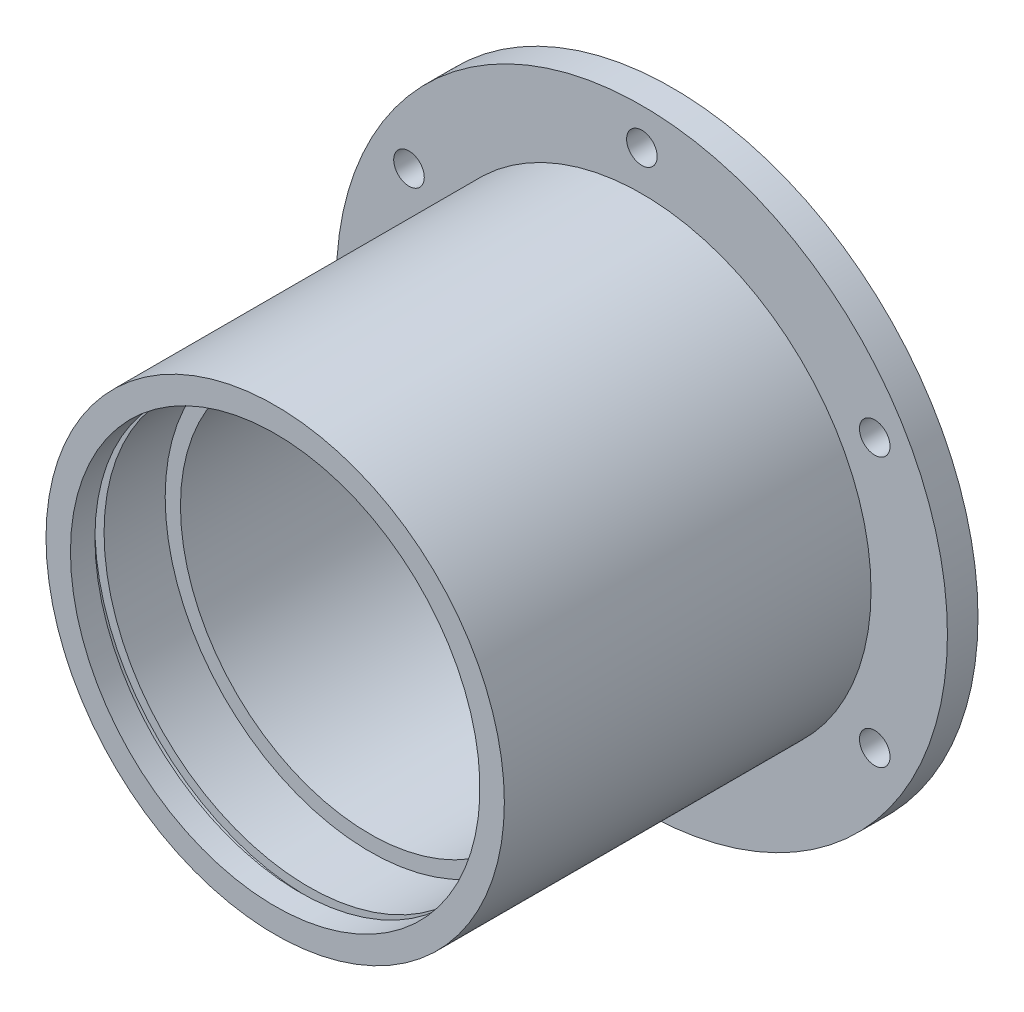
ISO-10303-21;
HEADER;
FILE_DESCRIPTION(('STEP AP214'),'2;1');
FILE_NAME('part.step','',(''),(''),'','','');
FILE_SCHEMA(('AUTOMOTIVE_DESIGN { 1 0 10303 214 1 1 1 1 }'));
ENDSEC;
DATA;
#1=APPLICATION_CONTEXT('core data for automotive mechanical design processes');
#2=APPLICATION_PROTOCOL_DEFINITION('international standard','automotive_design',2000,#1);
#3=PRODUCT_CONTEXT('',#1,'mechanical');
#4=PRODUCT('Part','Part','',(#3));
#5=PRODUCT_RELATED_PRODUCT_CATEGORY('part','',(#4));
#6=PRODUCT_DEFINITION_FORMATION('','',#4);
#7=PRODUCT_DEFINITION_CONTEXT('part definition',#1,'design');
#8=PRODUCT_DEFINITION('design','',#6,#7);
#9=PRODUCT_DEFINITION_SHAPE('','',#8);
#10=(LENGTH_UNIT() NAMED_UNIT(*) SI_UNIT(.MILLI.,.METRE.));
#11=(NAMED_UNIT(*) PLANE_ANGLE_UNIT() SI_UNIT($,.RADIAN.));
#12=(NAMED_UNIT(*) SI_UNIT($,.STERADIAN.) SOLID_ANGLE_UNIT());
#13=UNCERTAINTY_MEASURE_WITH_UNIT(LENGTH_MEASURE(1.E-05),#10,'distance_accuracy_value','');
#14=(GEOMETRIC_REPRESENTATION_CONTEXT(3) GLOBAL_UNCERTAINTY_ASSIGNED_CONTEXT((#13)) GLOBAL_UNIT_ASSIGNED_CONTEXT((#10,
#11,#12)) REPRESENTATION_CONTEXT('',''));
#15=CARTESIAN_POINT('',(0.,0.,0.));
#16=DIRECTION('',(0.,0.,1.));
#17=DIRECTION('',(1.,0.,0.));
#18=AXIS2_PLACEMENT_3D('',#15,#16,#17);
#19=CARTESIAN_POINT('',(0.,0.,65.));
#20=DIRECTION('',(0.,0.,-1.));
#21=DIRECTION('',(-1.,0.,0.));
#22=AXIS2_PLACEMENT_3D('',#19,#20,#21);
#23=CYLINDRICAL_SURFACE('',#22,33.5);
#24=CARTESIAN_POINT('',(0.,0.,49.5));
#25=DIRECTION('',(0.,0.,-1.));
#26=DIRECTION('',(-1.,0.,0.));
#27=AXIS2_PLACEMENT_3D('',#24,#25,#26);
#28=CIRCLE('',#27,33.5);
#29=CARTESIAN_POINT('',(-33.5,0.,49.5));
#30=VERTEX_POINT('',#29);
#31=EDGE_CURVE('E50',#30,#30,#28,.T.);
#32=CARTESIAN_POINT('',(0.,0.,59.5));
#33=DIRECTION('',(0.,0.,1.));
#34=DIRECTION('',(1.,0.,0.));
#35=AXIS2_PLACEMENT_3D('',#32,#33,#34);
#36=CIRCLE('',#35,33.5);
#37=CARTESIAN_POINT('',(-33.5,0.,59.5));
#38=VERTEX_POINT('',#37);
#39=EDGE_CURVE('E37',#38,#38,#36,.T.);
#40=CARTESIAN_POINT('',(-33.5,0.,49.5));
#41=CARTESIAN_POINT('',(-33.5,0.,49.6041666666667));
#42=CARTESIAN_POINT('',(-33.5,0.,49.7083333333333));
#43=CARTESIAN_POINT('',(-33.5,0.,49.9166666666667));
#44=CARTESIAN_POINT('',(-33.5,0.,50.0208333333333));
#45=CARTESIAN_POINT('',(-33.5,0.,50.2291666666667));
#46=CARTESIAN_POINT('',(-33.5,0.,50.3333333333333));
#47=CARTESIAN_POINT('',(-33.5,0.,50.5416666666667));
#48=CARTESIAN_POINT('',(-33.5,0.,50.6458333333333));
#49=CARTESIAN_POINT('',(-33.5,0.,50.8541666666667));
#50=CARTESIAN_POINT('',(-33.5,0.,50.9583333333333));
#51=CARTESIAN_POINT('',(-33.5,0.,51.1666666666667));
#52=CARTESIAN_POINT('',(-33.5,0.,51.2708333333333));
#53=CARTESIAN_POINT('',(-33.5,0.,51.4791666666667));
#54=CARTESIAN_POINT('',(-33.5,0.,51.5833333333333));
#55=CARTESIAN_POINT('',(-33.5,0.,51.7916666666667));
#56=CARTESIAN_POINT('',(-33.5,0.,51.8958333333333));
#57=CARTESIAN_POINT('',(-33.5,0.,52.1041666666667));
#58=CARTESIAN_POINT('',(-33.5,0.,52.2083333333333));
#59=CARTESIAN_POINT('',(-33.5,0.,52.4166666666667));
#60=CARTESIAN_POINT('',(-33.5,0.,52.5208333333333));
#61=CARTESIAN_POINT('',(-33.5,0.,52.7291666666667));
#62=CARTESIAN_POINT('',(-33.5,0.,52.8333333333333));
#63=CARTESIAN_POINT('',(-33.5,0.,53.0416666666667));
#64=CARTESIAN_POINT('',(-33.5,0.,53.1458333333333));
#65=CARTESIAN_POINT('',(-33.5,0.,53.3541666666667));
#66=CARTESIAN_POINT('',(-33.5,0.,53.4583333333333));
#67=CARTESIAN_POINT('',(-33.5,0.,53.6666666666667));
#68=CARTESIAN_POINT('',(-33.5,0.,53.7708333333333));
#69=CARTESIAN_POINT('',(-33.5,0.,53.9791666666667));
#70=CARTESIAN_POINT('',(-33.5,0.,54.0833333333333));
#71=CARTESIAN_POINT('',(-33.5,0.,54.2916666666667));
#72=CARTESIAN_POINT('',(-33.5,0.,54.3958333333333));
#73=CARTESIAN_POINT('',(-33.5,0.,54.6041666666667));
#74=CARTESIAN_POINT('',(-33.5,0.,54.7083333333333));
#75=CARTESIAN_POINT('',(-33.5,0.,54.9166666666667));
#76=CARTESIAN_POINT('',(-33.5,0.,55.0208333333333));
#77=CARTESIAN_POINT('',(-33.5,0.,55.2291666666667));
#78=CARTESIAN_POINT('',(-33.5,0.,55.3333333333333));
#79=CARTESIAN_POINT('',(-33.5,0.,55.5416666666667));
#80=CARTESIAN_POINT('',(-33.5,0.,55.6458333333333));
#81=CARTESIAN_POINT('',(-33.5,0.,55.8541666666667));
#82=CARTESIAN_POINT('',(-33.5,0.,55.9583333333333));
#83=CARTESIAN_POINT('',(-33.5,0.,56.1666666666667));
#84=CARTESIAN_POINT('',(-33.5,0.,56.2708333333333));
#85=CARTESIAN_POINT('',(-33.5,0.,56.4791666666667));
#86=CARTESIAN_POINT('',(-33.5,0.,56.5833333333333));
#87=CARTESIAN_POINT('',(-33.5,0.,56.7916666666667));
#88=CARTESIAN_POINT('',(-33.5,0.,56.8958333333333));
#89=CARTESIAN_POINT('',(-33.5,0.,57.1041666666667));
#90=CARTESIAN_POINT('',(-33.5,0.,57.2083333333333));
#91=CARTESIAN_POINT('',(-33.5,0.,57.4166666666667));
#92=CARTESIAN_POINT('',(-33.5,0.,57.5208333333333));
#93=CARTESIAN_POINT('',(-33.5,0.,57.7291666666667));
#94=CARTESIAN_POINT('',(-33.5,0.,57.8333333333333));
#95=CARTESIAN_POINT('',(-33.5,0.,58.0416666666667));
#96=CARTESIAN_POINT('',(-33.5,0.,58.1458333333333));
#97=CARTESIAN_POINT('',(-33.5,0.,58.3541666666667));
#98=CARTESIAN_POINT('',(-33.5,0.,58.4583333333333));
#99=CARTESIAN_POINT('',(-33.5,0.,58.6666666666667));
#100=CARTESIAN_POINT('',(-33.5,0.,58.7708333333333));
#101=CARTESIAN_POINT('',(-33.5,0.,58.9791666666667));
#102=CARTESIAN_POINT('',(-33.5,0.,59.0833333333333));
#103=CARTESIAN_POINT('',(-33.5,0.,59.2916666666667));
#104=CARTESIAN_POINT('',(-33.5,0.,59.3958333333333));
#105=CARTESIAN_POINT('',(-33.5,0.,59.5));
#106=B_SPLINE_CURVE_WITH_KNOTS('',3,(#40,#41,#42,#43,#44,#45,#46,#47,#48,#49,#50,#51,#52,#53,
#54,#55,#56,#57,#58,#59,#60,#61,#62,#63,#64,#65,#66,#67,#68,#69,#70,#71,#72,#73,#74,#75,#76,#77,
#78,#79,#80,#81,#82,#83,#84,#85,#86,#87,#88,#89,#90,#91,#92,#93,#94,#95,#96,#97,#98,#99,#100,
#101,#102,#103,#104,#105),.UNSPECIFIED.,.F.,.F.,(4,2,2,2,2,2,2,2,2,2,2,2,2,2,2,2,2,2,2,2,2,2,2,
2,2,2,2,2,2,2,2,2,4),(0.,0.3125,0.625000000000001,0.937500000000001,1.24999999999999,1.5625,
1.87499999999999,2.1875,2.5,2.8125,3.125,3.4375,3.75,4.0625,4.375,4.6875,5.,5.3125,5.625,
5.93749999999999,6.25,6.56249999999999,6.87499999999999,7.18749999999999,7.49999999999999,
7.81249999999999,8.12499999999999,8.43749999999999,8.74999999999999,9.06249999999999,
9.37499999999999,9.68749999999999,9.99999999999999),.UNSPECIFIED.);
#107=EDGE_CURVE('BSEAM33',#30,#38,#106,.T.);
#108=ORIENTED_EDGE('',*,*,#31,.T.);
#109=ORIENTED_EDGE('',*,*,#39,.T.);
#110=ORIENTED_EDGE('',*,*,#107,.T.);
#111=ORIENTED_EDGE('',*,*,#107,.F.);
#112=EDGE_LOOP('',(#108,#110,#109,#111));
#113=FACE_BOUND('',#112,.T.);
#114=ADVANCED_FACE('F33',(#113),#23,.F.);
#115=CARTESIAN_POINT('',(0.,0.,15.5));
#116=DIRECTION('',(0.,0.,-1.));
#117=DIRECTION('',(-1.,0.,0.));
#118=AXIS2_PLACEMENT_3D('',#115,#116,#117);
#119=CIRCLE('',#118,33.5);
#120=CARTESIAN_POINT('',(-33.5,0.,15.5));
#121=VERTEX_POINT('',#120);
#122=EDGE_CURVE('E11',#121,#121,#119,.T.);
#123=CARTESIAN_POINT('',(0.,0.,5.5));
#124=DIRECTION('',(0.,0.,-1.));
#125=DIRECTION('',(-1.,0.,0.));
#126=AXIS2_PLACEMENT_3D('',#123,#124,#125);
#127=CIRCLE('',#126,33.5);
#128=CARTESIAN_POINT('',(-33.5,0.,5.5));
#129=VERTEX_POINT('',#128);
#130=EDGE_CURVE('E58',#129,#129,#127,.T.);
#131=CARTESIAN_POINT('',(-33.5,0.,15.5));
#132=CARTESIAN_POINT('',(-33.5,0.,15.3958333333333));
#133=CARTESIAN_POINT('',(-33.5,0.,15.2916666666667));
#134=CARTESIAN_POINT('',(-33.5,0.,15.0833333333333));
#135=CARTESIAN_POINT('',(-33.5,0.,14.9791666666667));
#136=CARTESIAN_POINT('',(-33.5,0.,14.7708333333333));
#137=CARTESIAN_POINT('',(-33.5,0.,14.6666666666667));
#138=CARTESIAN_POINT('',(-33.5,0.,14.4583333333333));
#139=CARTESIAN_POINT('',(-33.5,0.,14.3541666666667));
#140=CARTESIAN_POINT('',(-33.5,0.,14.1458333333333));
#141=CARTESIAN_POINT('',(-33.5,0.,14.0416666666667));
#142=CARTESIAN_POINT('',(-33.5,0.,13.8333333333333));
#143=CARTESIAN_POINT('',(-33.5,0.,13.7291666666667));
#144=CARTESIAN_POINT('',(-33.5,0.,13.5208333333333));
#145=CARTESIAN_POINT('',(-33.5,0.,13.4166666666667));
#146=CARTESIAN_POINT('',(-33.5,0.,13.2083333333333));
#147=CARTESIAN_POINT('',(-33.5,0.,13.1041666666667));
#148=CARTESIAN_POINT('',(-33.5,0.,12.8958333333333));
#149=CARTESIAN_POINT('',(-33.5,0.,12.7916666666667));
#150=CARTESIAN_POINT('',(-33.5,0.,12.5833333333333));
#151=CARTESIAN_POINT('',(-33.5,0.,12.4791666666667));
#152=CARTESIAN_POINT('',(-33.5,0.,12.2708333333333));
#153=CARTESIAN_POINT('',(-33.5,0.,12.1666666666667));
#154=CARTESIAN_POINT('',(-33.5,0.,11.9583333333333));
#155=CARTESIAN_POINT('',(-33.5,0.,11.8541666666667));
#156=CARTESIAN_POINT('',(-33.5,0.,11.6458333333333));
#157=CARTESIAN_POINT('',(-33.5,0.,11.5416666666667));
#158=CARTESIAN_POINT('',(-33.5,0.,11.3333333333333));
#159=CARTESIAN_POINT('',(-33.5,0.,11.2291666666667));
#160=CARTESIAN_POINT('',(-33.5,0.,11.0208333333333));
#161=CARTESIAN_POINT('',(-33.5,0.,10.9166666666667));
#162=CARTESIAN_POINT('',(-33.5,0.,10.7083333333333));
#163=CARTESIAN_POINT('',(-33.5,0.,10.6041666666667));
#164=CARTESIAN_POINT('',(-33.5,0.,10.3958333333333));
#165=CARTESIAN_POINT('',(-33.5,0.,10.2916666666667));
#166=CARTESIAN_POINT('',(-33.5,0.,10.0833333333333));
#167=CARTESIAN_POINT('',(-33.5,0.,9.97916666666667));
#168=CARTESIAN_POINT('',(-33.5,0.,9.77083333333333));
#169=CARTESIAN_POINT('',(-33.5,0.,9.66666666666667));
#170=CARTESIAN_POINT('',(-33.5,0.,9.45833333333333));
#171=CARTESIAN_POINT('',(-33.5,0.,9.35416666666667));
#172=CARTESIAN_POINT('',(-33.5,0.,9.14583333333333));
#173=CARTESIAN_POINT('',(-33.5,0.,9.04166666666667));
#174=CARTESIAN_POINT('',(-33.5,0.,8.83333333333333));
#175=CARTESIAN_POINT('',(-33.5,0.,8.72916666666667));
#176=CARTESIAN_POINT('',(-33.5,0.,8.52083333333333));
#177=CARTESIAN_POINT('',(-33.5,0.,8.41666666666667));
#178=CARTESIAN_POINT('',(-33.5,0.,8.20833333333333));
#179=CARTESIAN_POINT('',(-33.5,0.,8.10416666666667));
#180=CARTESIAN_POINT('',(-33.5,0.,7.89583333333333));
#181=CARTESIAN_POINT('',(-33.5,0.,7.79166666666667));
#182=CARTESIAN_POINT('',(-33.5,0.,7.58333333333333));
#183=CARTESIAN_POINT('',(-33.5,0.,7.47916666666667));
#184=CARTESIAN_POINT('',(-33.5,0.,7.27083333333333));
#185=CARTESIAN_POINT('',(-33.5,0.,7.16666666666667));
#186=CARTESIAN_POINT('',(-33.5,0.,6.95833333333333));
#187=CARTESIAN_POINT('',(-33.5,0.,6.85416666666667));
#188=CARTESIAN_POINT('',(-33.5,0.,6.64583333333333));
#189=CARTESIAN_POINT('',(-33.5,0.,6.54166666666667));
#190=CARTESIAN_POINT('',(-33.5,0.,6.33333333333333));
#191=CARTESIAN_POINT('',(-33.5,0.,6.22916666666667));
#192=CARTESIAN_POINT('',(-33.5,0.,6.02083333333333));
#193=CARTESIAN_POINT('',(-33.5,0.,5.91666666666666));
#194=CARTESIAN_POINT('',(-33.5,0.,5.70833333333333));
#195=CARTESIAN_POINT('',(-33.5,0.,5.60416666666666));
#196=CARTESIAN_POINT('',(-33.5,0.,5.5));
#197=B_SPLINE_CURVE_WITH_KNOTS('',3,(#131,#132,#133,#134,#135,#136,#137,#138,#139,#140,#141,
#142,#143,#144,#145,#146,#147,#148,#149,#150,#151,#152,#153,#154,#155,#156,#157,#158,#159,#160,
#161,#162,#163,#164,#165,#166,#167,#168,#169,#170,#171,#172,#173,#174,#175,#176,#177,#178,#179,
#180,#181,#182,#183,#184,#185,#186,#187,#188,#189,#190,#191,#192,#193,#194,#195,#196),
.UNSPECIFIED.,.F.,.F.,(4,2,2,2,2,2,2,2,2,2,2,2,2,2,2,2,2,2,2,2,2,2,2,2,2,2,2,2,2,2,2,2,4),(0.,
0.3125,0.625000000000001,0.937500000000001,1.25,1.5625,1.875,2.1875,2.5,2.8125,3.125,3.4375,
3.75,4.0625,4.375,4.6875,5.,5.3125,5.62500000000001,5.93750000000001,6.25000000000001,
6.56250000000001,6.87500000000001,7.18750000000001,7.50000000000001,7.81250000000001,
8.12500000000001,8.43750000000001,8.75000000000001,9.06250000000001,9.37500000000001,
9.68750000000001,10.),.UNSPECIFIED.);
#198=EDGE_CURVE('BSEAM151',#121,#129,#197,.T.);
#199=ORIENTED_EDGE('',*,*,#122,.F.);
#200=ORIENTED_EDGE('',*,*,#130,.T.);
#201=ORIENTED_EDGE('',*,*,#198,.T.);
#202=ORIENTED_EDGE('',*,*,#198,.F.);
#203=EDGE_LOOP('',(#199,#201,#200,#202));
#204=FACE_BOUND('',#203,.T.);
#205=ADVANCED_FACE('F151',(#204),#23,.F.);
#206=CARTESIAN_POINT('',(0.,0.,0.));
#207=DIRECTION('',(0.,0.,-1.));
#208=DIRECTION('',(-1.,0.,0.));
#209=AXIS2_PLACEMENT_3D('',#206,#207,#208);
#210=CIRCLE('',#209,33.5);
#211=CARTESIAN_POINT('',(-33.5,0.,0.));
#212=VERTEX_POINT('',#211);
#213=EDGE_CURVE('E53',#212,#212,#210,.T.);
#214=CARTESIAN_POINT('',(0.,0.,4.));
#215=DIRECTION('',(0.,0.,1.));
#216=DIRECTION('',(1.,0.,0.));
#217=AXIS2_PLACEMENT_3D('',#214,#215,#216);
#218=CIRCLE('',#217,33.5);
#219=CARTESIAN_POINT('',(-33.5,0.,4.));
#220=VERTEX_POINT('',#219);
#221=EDGE_CURVE('E55',#220,#220,#218,.T.);
#222=CARTESIAN_POINT('',(-33.5,0.,0.));
#223=CARTESIAN_POINT('',(-33.5,0.,0.0416666666666805));
#224=CARTESIAN_POINT('',(-33.5,0.,0.0833333333333473));
#225=CARTESIAN_POINT('',(-33.5,0.,0.166666666666681));
#226=CARTESIAN_POINT('',(-33.5,0.,0.208333333333347));
#227=CARTESIAN_POINT('',(-33.5,0.,0.291666666666681));
#228=CARTESIAN_POINT('',(-33.5,0.,0.333333333333347));
#229=CARTESIAN_POINT('',(-33.5,0.,0.416666666666681));
#230=CARTESIAN_POINT('',(-33.5,0.,0.458333333333348));
#231=CARTESIAN_POINT('',(-33.5,0.,0.541666666666681));
#232=CARTESIAN_POINT('',(-33.5,0.,0.583333333333348));
#233=CARTESIAN_POINT('',(-33.5,0.,0.666666666666681));
#234=CARTESIAN_POINT('',(-33.5,0.,0.708333333333348));
#235=CARTESIAN_POINT('',(-33.5,0.,0.791666666666681));
#236=CARTESIAN_POINT('',(-33.5,0.,0.833333333333348));
#237=CARTESIAN_POINT('',(-33.5,0.,0.916666666666681));
#238=CARTESIAN_POINT('',(-33.5,0.,0.958333333333348));
#239=CARTESIAN_POINT('',(-33.5,0.,1.04166666666668));
#240=CARTESIAN_POINT('',(-33.5,0.,1.08333333333335));
#241=CARTESIAN_POINT('',(-33.5,0.,1.16666666666668));
#242=CARTESIAN_POINT('',(-33.5,0.,1.20833333333335));
#243=CARTESIAN_POINT('',(-33.5,0.,1.29166666666668));
#244=CARTESIAN_POINT('',(-33.5,0.,1.33333333333335));
#245=CARTESIAN_POINT('',(-33.5,0.,1.41666666666668));
#246=CARTESIAN_POINT('',(-33.5,0.,1.45833333333335));
#247=CARTESIAN_POINT('',(-33.5,0.,1.54166666666668));
#248=CARTESIAN_POINT('',(-33.5,0.,1.58333333333335));
#249=CARTESIAN_POINT('',(-33.5,0.,1.66666666666668));
#250=CARTESIAN_POINT('',(-33.5,0.,1.70833333333335));
#251=CARTESIAN_POINT('',(-33.5,0.,1.79166666666668));
#252=CARTESIAN_POINT('',(-33.5,0.,1.83333333333335));
#253=CARTESIAN_POINT('',(-33.5,0.,1.91666666666668));
#254=CARTESIAN_POINT('',(-33.5,0.,1.95833333333335));
#255=CARTESIAN_POINT('',(-33.5,0.,2.04166666666668));
#256=CARTESIAN_POINT('',(-33.5,0.,2.08333333333334));
#257=CARTESIAN_POINT('',(-33.5,0.,2.16666666666667));
#258=CARTESIAN_POINT('',(-33.5,0.,2.20833333333334));
#259=CARTESIAN_POINT('',(-33.5,0.,2.29166666666667));
#260=CARTESIAN_POINT('',(-33.5,0.,2.33333333333334));
#261=CARTESIAN_POINT('',(-33.5,0.,2.41666666666667));
#262=CARTESIAN_POINT('',(-33.5,0.,2.45833333333334));
#263=CARTESIAN_POINT('',(-33.5,0.,2.54166666666667));
#264=CARTESIAN_POINT('',(-33.5,0.,2.58333333333334));
#265=CARTESIAN_POINT('',(-33.5,0.,2.66666666666667));
#266=CARTESIAN_POINT('',(-33.5,0.,2.70833333333334));
#267=CARTESIAN_POINT('',(-33.5,0.,2.79166666666667));
#268=CARTESIAN_POINT('',(-33.5,0.,2.83333333333334));
#269=CARTESIAN_POINT('',(-33.5,0.,2.91666666666667));
#270=CARTESIAN_POINT('',(-33.5,0.,2.95833333333333));
#271=CARTESIAN_POINT('',(-33.5,0.,3.04166666666666));
#272=CARTESIAN_POINT('',(-33.5,0.,3.08333333333333));
#273=CARTESIAN_POINT('',(-33.5,0.,3.16666666666666));
#274=CARTESIAN_POINT('',(-33.5,0.,3.20833333333333));
#275=CARTESIAN_POINT('',(-33.5,0.,3.29166666666666));
#276=CARTESIAN_POINT('',(-33.5,0.,3.33333333333333));
#277=CARTESIAN_POINT('',(-33.5,0.,3.41666666666666));
#278=CARTESIAN_POINT('',(-33.5,0.,3.45833333333333));
#279=CARTESIAN_POINT('',(-33.5,0.,3.54166666666666));
#280=CARTESIAN_POINT('',(-33.5,0.,3.58333333333333));
#281=CARTESIAN_POINT('',(-33.5,0.,3.66666666666666));
#282=CARTESIAN_POINT('',(-33.5,0.,3.70833333333333));
#283=CARTESIAN_POINT('',(-33.5,0.,3.79166666666666));
#284=CARTESIAN_POINT('',(-33.5,0.,3.83333333333333));
#285=CARTESIAN_POINT('',(-33.5,0.,3.91666666666666));
#286=CARTESIAN_POINT('',(-33.5,0.,3.95833333333333));
#287=CARTESIAN_POINT('',(-33.5,0.,4.));
#288=B_SPLINE_CURVE_WITH_KNOTS('',3,(#222,#223,#224,#225,#226,#227,#228,#229,#230,#231,#232,
#233,#234,#235,#236,#237,#238,#239,#240,#241,#242,#243,#244,#245,#246,#247,#248,#249,#250,#251,
#252,#253,#254,#255,#256,#257,#258,#259,#260,#261,#262,#263,#264,#265,#266,#267,#268,#269,#270,
#271,#272,#273,#274,#275,#276,#277,#278,#279,#280,#281,#282,#283,#284,#285,#286,#287),
.UNSPECIFIED.,.F.,.F.,(4,2,2,2,2,2,2,2,2,2,2,2,2,2,2,2,2,2,2,2,2,2,2,2,2,2,2,2,2,2,2,2,4),(0.,
0.125,0.25,0.375,0.5,0.625000000000001,0.750000000000001,0.875000000000001,1.,1.125,1.25,1.375,
1.5,1.625,1.75,1.875,2.,2.12499999999999,2.24999999999999,2.37499999999999,2.49999999999999,
2.62499999999999,2.74999999999999,2.87499999999999,2.99999999999998,3.12499999999998,
3.24999999999998,3.37499999999998,3.49999999999998,3.62499999999998,3.74999999999998,
3.87499999999998,3.99999999999998),.UNSPECIFIED.);
#289=EDGE_CURVE('BSEAM154',#212,#220,#288,.T.);
#290=ORIENTED_EDGE('',*,*,#213,.T.);
#291=ORIENTED_EDGE('',*,*,#221,.T.);
#292=ORIENTED_EDGE('',*,*,#289,.T.);
#293=ORIENTED_EDGE('',*,*,#289,.F.);
#294=EDGE_LOOP('',(#290,#292,#291,#293));
#295=FACE_BOUND('',#294,.T.);
#296=ADVANCED_FACE('F154',(#295),#23,.F.);
#297=CARTESIAN_POINT('',(0.,0.,61.));
#298=DIRECTION('',(0.,0.,1.));
#299=DIRECTION('',(1.,0.,0.));
#300=AXIS2_PLACEMENT_3D('',#297,#298,#299);
#301=CIRCLE('',#300,33.5);
#302=CARTESIAN_POINT('',(-33.5,0.,61.));
#303=VERTEX_POINT('',#302);
#304=EDGE_CURVE('E62',#303,#303,#301,.T.);
#305=CARTESIAN_POINT('',(0.,0.,65.));
#306=DIRECTION('',(0.,0.,1.));
#307=DIRECTION('',(1.,0.,0.));
#308=AXIS2_PLACEMENT_3D('',#305,#306,#307);
#309=CIRCLE('',#308,33.5);
#310=CARTESIAN_POINT('',(-33.5,0.,65.));
#311=VERTEX_POINT('',#310);
#312=EDGE_CURVE('E87',#311,#311,#309,.T.);
#313=CARTESIAN_POINT('',(-33.5,0.,61.));
#314=CARTESIAN_POINT('',(-33.5,0.,61.0416666666667));
#315=CARTESIAN_POINT('',(-33.5,0.,61.0833333333333));
#316=CARTESIAN_POINT('',(-33.5,0.,61.1666666666667));
#317=CARTESIAN_POINT('',(-33.5,0.,61.2083333333333));
#318=CARTESIAN_POINT('',(-33.5,0.,61.2916666666667));
#319=CARTESIAN_POINT('',(-33.5,0.,61.3333333333333));
#320=CARTESIAN_POINT('',(-33.5,0.,61.4166666666667));
#321=CARTESIAN_POINT('',(-33.5,0.,61.4583333333333));
#322=CARTESIAN_POINT('',(-33.5,0.,61.5416666666667));
#323=CARTESIAN_POINT('',(-33.5,0.,61.5833333333333));
#324=CARTESIAN_POINT('',(-33.5,0.,61.6666666666667));
#325=CARTESIAN_POINT('',(-33.5,0.,61.7083333333333));
#326=CARTESIAN_POINT('',(-33.5,0.,61.7916666666667));
#327=CARTESIAN_POINT('',(-33.5,0.,61.8333333333333));
#328=CARTESIAN_POINT('',(-33.5,0.,61.9166666666667));
#329=CARTESIAN_POINT('',(-33.5,0.,61.9583333333333));
#330=CARTESIAN_POINT('',(-33.5,0.,62.0416666666667));
#331=CARTESIAN_POINT('',(-33.5,0.,62.0833333333333));
#332=CARTESIAN_POINT('',(-33.5,0.,62.1666666666667));
#333=CARTESIAN_POINT('',(-33.5,0.,62.2083333333333));
#334=CARTESIAN_POINT('',(-33.5,0.,62.2916666666667));
#335=CARTESIAN_POINT('',(-33.5,0.,62.3333333333333));
#336=CARTESIAN_POINT('',(-33.5,0.,62.4166666666667));
#337=CARTESIAN_POINT('',(-33.5,0.,62.4583333333333));
#338=CARTESIAN_POINT('',(-33.5,0.,62.5416666666667));
#339=CARTESIAN_POINT('',(-33.5,0.,62.5833333333333));
#340=CARTESIAN_POINT('',(-33.5,0.,62.6666666666667));
#341=CARTESIAN_POINT('',(-33.5,0.,62.7083333333333));
#342=CARTESIAN_POINT('',(-33.5,0.,62.7916666666667));
#343=CARTESIAN_POINT('',(-33.5,0.,62.8333333333333));
#344=CARTESIAN_POINT('',(-33.5,0.,62.9166666666667));
#345=CARTESIAN_POINT('',(-33.5,0.,62.9583333333333));
#346=CARTESIAN_POINT('',(-33.5,0.,63.0416666666667));
#347=CARTESIAN_POINT('',(-33.5,0.,63.0833333333333));
#348=CARTESIAN_POINT('',(-33.5,0.,63.1666666666667));
#349=CARTESIAN_POINT('',(-33.5,0.,63.2083333333333));
#350=CARTESIAN_POINT('',(-33.5,0.,63.2916666666667));
#351=CARTESIAN_POINT('',(-33.5,0.,63.3333333333333));
#352=CARTESIAN_POINT('',(-33.5,0.,63.4166666666667));
#353=CARTESIAN_POINT('',(-33.5,0.,63.4583333333333));
#354=CARTESIAN_POINT('',(-33.5,0.,63.5416666666667));
#355=CARTESIAN_POINT('',(-33.5,0.,63.5833333333333));
#356=CARTESIAN_POINT('',(-33.5,0.,63.6666666666667));
#357=CARTESIAN_POINT('',(-33.5,0.,63.7083333333333));
#358=CARTESIAN_POINT('',(-33.5,0.,63.7916666666667));
#359=CARTESIAN_POINT('',(-33.5,0.,63.8333333333333));
#360=CARTESIAN_POINT('',(-33.5,0.,63.9166666666667));
#361=CARTESIAN_POINT('',(-33.5,0.,63.9583333333333));
#362=CARTESIAN_POINT('',(-33.5,0.,64.0416666666667));
#363=CARTESIAN_POINT('',(-33.5,0.,64.0833333333333));
#364=CARTESIAN_POINT('',(-33.5,0.,64.1666666666667));
#365=CARTESIAN_POINT('',(-33.5,0.,64.2083333333333));
#366=CARTESIAN_POINT('',(-33.5,0.,64.2916666666667));
#367=CARTESIAN_POINT('',(-33.5,0.,64.3333333333333));
#368=CARTESIAN_POINT('',(-33.5,0.,64.4166666666667));
#369=CARTESIAN_POINT('',(-33.5,0.,64.4583333333333));
#370=CARTESIAN_POINT('',(-33.5,0.,64.5416666666667));
#371=CARTESIAN_POINT('',(-33.5,0.,64.5833333333333));
#372=CARTESIAN_POINT('',(-33.5,0.,64.6666666666667));
#373=CARTESIAN_POINT('',(-33.5,0.,64.7083333333333));
#374=CARTESIAN_POINT('',(-33.5,0.,64.7916666666667));
#375=CARTESIAN_POINT('',(-33.5,0.,64.8333333333333));
#376=CARTESIAN_POINT('',(-33.5,0.,64.9166666666667));
#377=CARTESIAN_POINT('',(-33.5,0.,64.9583333333333));
#378=CARTESIAN_POINT('',(-33.5,0.,65.));
#379=B_SPLINE_CURVE_WITH_KNOTS('',3,(#313,#314,#315,#316,#317,#318,#319,#320,#321,#322,#323,
#324,#325,#326,#327,#328,#329,#330,#331,#332,#333,#334,#335,#336,#337,#338,#339,#340,#341,#342,
#343,#344,#345,#346,#347,#348,#349,#350,#351,#352,#353,#354,#355,#356,#357,#358,#359,#360,#361,
#362,#363,#364,#365,#366,#367,#368,#369,#370,#371,#372,#373,#374,#375,#376,#377,#378),
.UNSPECIFIED.,.F.,.F.,(4,2,2,2,2,2,2,2,2,2,2,2,2,2,2,2,2,2,2,2,2,2,2,2,2,2,2,2,2,2,2,2,4),(0.,
0.125,0.25,0.375,0.5,0.625000000000001,0.750000000000001,0.875000000000001,1.,1.125,1.25,1.375,
1.5,1.62500000000001,1.75000000000001,1.87500000000001,2.00000000000001,2.12500000000001,
2.25000000000001,2.37500000000001,2.50000000000001,2.62500000000001,2.75000000000001,
2.87500000000001,3.00000000000001,3.12500000000001,3.25000000000001,3.37500000000001,
3.50000000000001,3.62500000000001,3.75000000000001,3.87500000000001,4.00000000000001),.UNSPECIFIED.);
#380=EDGE_CURVE('BSEAM159',#303,#311,#379,.T.);
#381=ORIENTED_EDGE('',*,*,#304,.F.);
#382=ORIENTED_EDGE('',*,*,#312,.T.);
#383=ORIENTED_EDGE('',*,*,#380,.T.);
#384=ORIENTED_EDGE('',*,*,#380,.F.);
#385=EDGE_LOOP('',(#381,#383,#382,#384));
#386=FACE_BOUND('',#385,.T.);
#387=ADVANCED_FACE('F159',(#386),#23,.F.);
#388=CARTESIAN_POINT('',(0.,0.,5.));
#389=DIRECTION('',(0.,0.,1.));
#390=DIRECTION('',(1.,0.,0.));
#391=AXIS2_PLACEMENT_3D('',#388,#389,#390);
#392=PLANE('',#391);
#393=CARTESIAN_POINT('',(0.,0.,5.));
#394=DIRECTION('',(0.,0.,1.));
#395=DIRECTION('',(1.,0.,0.));
#396=AXIS2_PLACEMENT_3D('',#393,#394,#395);
#397=CIRCLE('',#396,37.5);
#398=CARTESIAN_POINT('',(-37.5,0.,5.));
#399=VERTEX_POINT('',#398);
#400=EDGE_CURVE('E90',#399,#399,#397,.T.);
#401=ORIENTED_EDGE('',*,*,#400,.F.);
#402=EDGE_LOOP('',(#401));
#403=FACE_BOUND('',#402,.T.);
#404=CARTESIAN_POINT('',(-38.1051177665146,-22.0000000000004,5.));
#405=DIRECTION('',(0.,0.,1.));
#406=DIRECTION('',(1.,0.,0.));
#407=AXIS2_PLACEMENT_3D('',#404,#405,#406);
#408=CIRCLE('',#407,2.50000000000115);
#409=CARTESIAN_POINT('',(-35.6051177665134,-22.0000000000004,5.));
#410=VERTEX_POINT('',#409);
#411=EDGE_CURVE('E103',#410,#410,#408,.T.);
#412=ORIENTED_EDGE('',*,*,#411,.F.);
#413=EDGE_LOOP('',(#412));
#414=FACE_BOUND('',#413,.T.);
#415=CARTESIAN_POINT('',(38.105117766516,-21.9999999999996,5.));
#416=DIRECTION('',(0.,0.,1.));
#417=DIRECTION('',(1.,0.,0.));
#418=AXIS2_PLACEMENT_3D('',#415,#416,#417);
#419=CIRCLE('',#418,2.50000000000115);
#420=CARTESIAN_POINT('',(40.6051177665172,-21.9999999999996,5.));
#421=VERTEX_POINT('',#420);
#422=EDGE_CURVE('E115',#421,#421,#419,.T.);
#423=ORIENTED_EDGE('',*,*,#422,.F.);
#424=EDGE_LOOP('',(#423));
#425=FACE_BOUND('',#424,.T.);
#426=CARTESIAN_POINT('',(0.,44.,5.));
#427=DIRECTION('',(0.,0.,1.));
#428=DIRECTION('',(1.,0.,0.));
#429=AXIS2_PLACEMENT_3D('',#426,#427,#428);
#430=CIRCLE('',#429,2.50000000000114);
#431=CARTESIAN_POINT('',(2.50000000000114,44.,5.));
#432=VERTEX_POINT('',#431);
#433=EDGE_CURVE('E127',#432,#432,#430,.T.);
#434=ORIENTED_EDGE('',*,*,#433,.F.);
#435=EDGE_LOOP('',(#434));
#436=FACE_BOUND('',#435,.T.);
#437=CARTESIAN_POINT('',(0.,0.,5.));
#438=DIRECTION('',(0.,0.,1.));
#439=DIRECTION('',(1.,0.,0.));
#440=AXIS2_PLACEMENT_3D('',#437,#438,#439);
#441=CIRCLE('',#440,50.);
#442=CARTESIAN_POINT('',(50.,0.,5.));
#443=VERTEX_POINT('',#442);
#444=EDGE_CURVE('E41',#443,#443,#441,.T.);
#445=ORIENTED_EDGE('',*,*,#444,.T.);
#446=EDGE_LOOP('',(#445));
#447=FACE_BOUND('',#446,.T.);
#448=CARTESIAN_POINT('',(38.1051177665155,22.0000000000004,5.));
#449=DIRECTION('',(0.,0.,1.));
#450=DIRECTION('',(1.,0.,0.));
#451=AXIS2_PLACEMENT_3D('',#448,#449,#450);
#452=CIRCLE('',#451,2.50000000000115);
#453=CARTESIAN_POINT('',(40.6051177665167,22.0000000000004,5.));
#454=VERTEX_POINT('',#453);
#455=EDGE_CURVE('E121',#454,#454,#452,.T.);
#456=ORIENTED_EDGE('',*,*,#455,.F.);
#457=EDGE_LOOP('',(#456));
#458=FACE_BOUND('',#457,.T.);
#459=CARTESIAN_POINT('',(9.82145968032923E-13,-44.,5.));
#460=DIRECTION('',(0.,0.,1.));
#461=DIRECTION('',(1.,0.,0.));
#462=AXIS2_PLACEMENT_3D('',#459,#460,#461);
#463=CIRCLE('',#462,2.50000000000117);
#464=CARTESIAN_POINT('',(2.50000000000216,-44.,5.));
#465=VERTEX_POINT('',#464);
#466=EDGE_CURVE('E109',#465,#465,#463,.T.);
#467=ORIENTED_EDGE('',*,*,#466,.F.);
#468=EDGE_LOOP('',(#467));
#469=FACE_BOUND('',#468,.T.);
#470=CARTESIAN_POINT('',(-38.1051177665151,21.9999999999995,5.));
#471=DIRECTION('',(0.,0.,1.));
#472=DIRECTION('',(1.,0.,0.));
#473=AXIS2_PLACEMENT_3D('',#470,#471,#472);
#474=CIRCLE('',#473,2.50000000000115);
#475=CARTESIAN_POINT('',(-35.6051177665139,21.9999999999995,5.));
#476=VERTEX_POINT('',#475);
#477=EDGE_CURVE('E97',#476,#476,#474,.T.);
#478=ORIENTED_EDGE('',*,*,#477,.F.);
#479=EDGE_LOOP('',(#478));
#480=FACE_BOUND('',#479,.T.);
#481=ADVANCED_FACE('F168',(#403,#414,#425,#436,#447,#458,#469,#480),#392,.T.);
#482=CARTESIAN_POINT('',(0.,0.,0.));
#483=DIRECTION('',(0.,0.,1.));
#484=DIRECTION('',(1.,0.,0.));
#485=AXIS2_PLACEMENT_3D('',#482,#483,#484);
#486=PLANE('',#485);
#487=ORIENTED_EDGE('',*,*,#213,.F.);
#488=EDGE_LOOP('',(#487));
#489=FACE_BOUND('',#488,.T.);
#490=CARTESIAN_POINT('',(0.,0.,0.));
#491=DIRECTION('',(0.,0.,1.));
#492=DIRECTION('',(1.,0.,0.));
#493=AXIS2_PLACEMENT_3D('',#490,#491,#492);
#494=CIRCLE('',#493,50.);
#495=CARTESIAN_POINT('',(50.,0.,0.));
#496=VERTEX_POINT('',#495);
#497=EDGE_CURVE('E46',#496,#496,#494,.T.);
#498=ORIENTED_EDGE('',*,*,#497,.F.);
#499=EDGE_LOOP('',(#498));
#500=FACE_BOUND('',#499,.T.);
#501=CARTESIAN_POINT('',(0.,44.,0.));
#502=DIRECTION('',(0.,0.,1.));
#503=DIRECTION('',(1.,0.,0.));
#504=AXIS2_PLACEMENT_3D('',#501,#502,#503);
#505=CIRCLE('',#504,2.50000000000114);
#506=CARTESIAN_POINT('',(2.50000000000114,44.,0.));
#507=VERTEX_POINT('',#506);
#508=EDGE_CURVE('E124',#507,#507,#505,.T.);
#509=ORIENTED_EDGE('',*,*,#508,.T.);
#510=EDGE_LOOP('',(#509));
#511=FACE_BOUND('',#510,.T.);
#512=CARTESIAN_POINT('',(38.1051177665155,22.0000000000004,0.));
#513=DIRECTION('',(0.,0.,1.));
#514=DIRECTION('',(1.,0.,0.));
#515=AXIS2_PLACEMENT_3D('',#512,#513,#514);
#516=CIRCLE('',#515,2.50000000000115);
#517=CARTESIAN_POINT('',(40.6051177665167,22.0000000000004,0.));
#518=VERTEX_POINT('',#517);
#519=EDGE_CURVE('E118',#518,#518,#516,.T.);
#520=ORIENTED_EDGE('',*,*,#519,.T.);
#521=EDGE_LOOP('',(#520));
#522=FACE_BOUND('',#521,.T.);
#523=CARTESIAN_POINT('',(38.105117766516,-21.9999999999996,0.));
#524=DIRECTION('',(0.,0.,1.));
#525=DIRECTION('',(1.,0.,0.));
#526=AXIS2_PLACEMENT_3D('',#523,#524,#525);
#527=CIRCLE('',#526,2.50000000000115);
#528=CARTESIAN_POINT('',(40.6051177665172,-21.9999999999996,0.));
#529=VERTEX_POINT('',#528);
#530=EDGE_CURVE('E112',#529,#529,#527,.T.);
#531=ORIENTED_EDGE('',*,*,#530,.T.);
#532=EDGE_LOOP('',(#531));
#533=FACE_BOUND('',#532,.T.);
#534=CARTESIAN_POINT('',(9.82145968032923E-13,-44.,0.));
#535=DIRECTION('',(0.,0.,1.));
#536=DIRECTION('',(1.,0.,0.));
#537=AXIS2_PLACEMENT_3D('',#534,#535,#536);
#538=CIRCLE('',#537,2.50000000000117);
#539=CARTESIAN_POINT('',(2.50000000000216,-44.,0.));
#540=VERTEX_POINT('',#539);
#541=EDGE_CURVE('E106',#540,#540,#538,.T.);
#542=ORIENTED_EDGE('',*,*,#541,.T.);
#543=EDGE_LOOP('',(#542));
#544=FACE_BOUND('',#543,.T.);
#545=CARTESIAN_POINT('',(-38.1051177665146,-22.0000000000004,0.));
#546=DIRECTION('',(0.,0.,1.));
#547=DIRECTION('',(1.,0.,0.));
#548=AXIS2_PLACEMENT_3D('',#545,#546,#547);
#549=CIRCLE('',#548,2.50000000000115);
#550=CARTESIAN_POINT('',(-35.6051177665134,-22.0000000000004,0.));
#551=VERTEX_POINT('',#550);
#552=EDGE_CURVE('E100',#551,#551,#549,.T.);
#553=ORIENTED_EDGE('',*,*,#552,.T.);
#554=EDGE_LOOP('',(#553));
#555=FACE_BOUND('',#554,.T.);
#556=CARTESIAN_POINT('',(-38.1051177665151,21.9999999999995,0.));
#557=DIRECTION('',(0.,0.,1.));
#558=DIRECTION('',(1.,0.,0.));
#559=AXIS2_PLACEMENT_3D('',#556,#557,#558);
#560=CIRCLE('',#559,2.50000000000115);
#561=CARTESIAN_POINT('',(-35.6051177665139,21.9999999999995,0.));
#562=VERTEX_POINT('',#561);
#563=EDGE_CURVE('E94',#562,#562,#560,.T.);
#564=ORIENTED_EDGE('',*,*,#563,.T.);
#565=EDGE_LOOP('',(#564));
#566=FACE_BOUND('',#565,.T.);
#567=ADVANCED_FACE('F133',(#489,#500,#511,#522,#533,#544,#555,#566),#486,.F.);
#568=CARTESIAN_POINT('',(0.,0.,5.));
#569=DIRECTION('',(0.,0.,-1.));
#570=DIRECTION('',(-1.,0.,0.));
#571=AXIS2_PLACEMENT_3D('',#568,#569,#570);
#572=CYLINDRICAL_SURFACE('',#571,50.);
#573=ORIENTED_EDGE('',*,*,#444,.F.);
#574=EDGE_LOOP('',(#573));
#575=FACE_BOUND('',#574,.T.);
#576=ORIENTED_EDGE('',*,*,#497,.T.);
#577=EDGE_LOOP('',(#576));
#578=FACE_BOUND('',#577,.T.);
#579=ADVANCED_FACE('F35',(#575,#578),#572,.T.);
#580=CARTESIAN_POINT('',(0.,44.,5.));
#581=DIRECTION('',(0.,0.,-1.));
#582=DIRECTION('',(-1.,0.,0.));
#583=AXIS2_PLACEMENT_3D('',#580,#581,#582);
#584=CYLINDRICAL_SURFACE('',#583,2.50000000000114);
#585=ORIENTED_EDGE('',*,*,#433,.T.);
#586=EDGE_LOOP('',(#585));
#587=FACE_BOUND('',#586,.T.);
#588=ORIENTED_EDGE('',*,*,#508,.F.);
#589=EDGE_LOOP('',(#588));
#590=FACE_BOUND('',#589,.T.);
#591=ADVANCED_FACE('F136',(#587,#590),#584,.F.);
#592=CARTESIAN_POINT('',(38.1051177665155,22.0000000000004,5.));
#593=DIRECTION('',(0.,0.,-1.));
#594=DIRECTION('',(-1.,0.,0.));
#595=AXIS2_PLACEMENT_3D('',#592,#593,#594);
#596=CYLINDRICAL_SURFACE('',#595,2.50000000000115);
#597=ORIENTED_EDGE('',*,*,#455,.T.);
#598=EDGE_LOOP('',(#597));
#599=FACE_BOUND('',#598,.T.);
#600=ORIENTED_EDGE('',*,*,#519,.F.);
#601=EDGE_LOOP('',(#600));
#602=FACE_BOUND('',#601,.T.);
#603=ADVANCED_FACE('F138',(#599,#602),#596,.F.);
#604=CARTESIAN_POINT('',(38.105117766516,-21.9999999999996,5.));
#605=DIRECTION('',(0.,0.,-1.));
#606=DIRECTION('',(-1.,0.,0.));
#607=AXIS2_PLACEMENT_3D('',#604,#605,#606);
#608=CYLINDRICAL_SURFACE('',#607,2.50000000000115);
#609=ORIENTED_EDGE('',*,*,#422,.T.);
#610=EDGE_LOOP('',(#609));
#611=FACE_BOUND('',#610,.T.);
#612=ORIENTED_EDGE('',*,*,#530,.F.);
#613=EDGE_LOOP('',(#612));
#614=FACE_BOUND('',#613,.T.);
#615=ADVANCED_FACE('F145',(#611,#614),#608,.F.);
#616=CARTESIAN_POINT('',(9.82145968032923E-13,-44.,5.));
#617=DIRECTION('',(0.,0.,-1.));
#618=DIRECTION('',(-1.,0.,0.));
#619=AXIS2_PLACEMENT_3D('',#616,#617,#618);
#620=CYLINDRICAL_SURFACE('',#619,2.50000000000117);
#621=ORIENTED_EDGE('',*,*,#466,.T.);
#622=EDGE_LOOP('',(#621));
#623=FACE_BOUND('',#622,.T.);
#624=ORIENTED_EDGE('',*,*,#541,.F.);
#625=EDGE_LOOP('',(#624));
#626=FACE_BOUND('',#625,.T.);
#627=ADVANCED_FACE('F232',(#623,#626),#620,.F.);
#628=CARTESIAN_POINT('',(-38.1051177665146,-22.0000000000004,5.));
#629=DIRECTION('',(0.,0.,-1.));
#630=DIRECTION('',(-1.,0.,0.));
#631=AXIS2_PLACEMENT_3D('',#628,#629,#630);
#632=CYLINDRICAL_SURFACE('',#631,2.50000000000115);
#633=ORIENTED_EDGE('',*,*,#411,.T.);
#634=EDGE_LOOP('',(#633));
#635=FACE_BOUND('',#634,.T.);
#636=ORIENTED_EDGE('',*,*,#552,.F.);
#637=EDGE_LOOP('',(#636));
#638=FACE_BOUND('',#637,.T.);
#639=ADVANCED_FACE('F228',(#635,#638),#632,.F.);
#640=CARTESIAN_POINT('',(-38.1051177665151,21.9999999999995,5.));
#641=DIRECTION('',(0.,0.,-1.));
#642=DIRECTION('',(-1.,0.,0.));
#643=AXIS2_PLACEMENT_3D('',#640,#641,#642);
#644=CYLINDRICAL_SURFACE('',#643,2.50000000000115);
#645=ORIENTED_EDGE('',*,*,#477,.T.);
#646=EDGE_LOOP('',(#645));
#647=FACE_BOUND('',#646,.T.);
#648=ORIENTED_EDGE('',*,*,#563,.F.);
#649=EDGE_LOOP('',(#648));
#650=FACE_BOUND('',#649,.T.);
#651=ADVANCED_FACE('F221',(#647,#650),#644,.F.);
#652=CARTESIAN_POINT('',(0.,0.,65.));
#653=DIRECTION('',(0.,0.,1.));
#654=DIRECTION('',(1.,0.,0.));
#655=AXIS2_PLACEMENT_3D('',#652,#653,#654);
#656=PLANE('',#655);
#657=CARTESIAN_POINT('',(0.,0.,65.));
#658=DIRECTION('',(0.,0.,1.));
#659=DIRECTION('',(1.,0.,0.));
#660=AXIS2_PLACEMENT_3D('',#657,#658,#659);
#661=CIRCLE('',#660,37.5);
#662=CARTESIAN_POINT('',(-37.5,0.,65.));
#663=VERTEX_POINT('',#662);
#664=EDGE_CURVE('E91',#663,#663,#661,.T.);
#665=ORIENTED_EDGE('',*,*,#664,.T.);
#666=EDGE_LOOP('',(#665));
#667=FACE_BOUND('',#666,.T.);
#668=ORIENTED_EDGE('',*,*,#312,.F.);
#669=EDGE_LOOP('',(#668));
#670=FACE_BOUND('',#669,.T.);
#671=ADVANCED_FACE('F210',(#667,#670),#656,.T.);
#672=CARTESIAN_POINT('',(0.,0.,65.));
#673=DIRECTION('',(0.,0.,-1.));
#674=DIRECTION('',(-1.,0.,0.));
#675=AXIS2_PLACEMENT_3D('',#672,#673,#674);
#676=CYLINDRICAL_SURFACE('',#675,37.5);
#677=CARTESIAN_POINT('',(-37.5,0.,65.));
#678=CARTESIAN_POINT('',(-37.5,0.,64.375));
#679=CARTESIAN_POINT('',(-37.5,0.,63.75));
#680=CARTESIAN_POINT('',(-37.5,0.,62.5));
#681=CARTESIAN_POINT('',(-37.5,0.,61.875));
#682=CARTESIAN_POINT('',(-37.5,0.,60.625));
#683=CARTESIAN_POINT('',(-37.5,0.,60.));
#684=CARTESIAN_POINT('',(-37.5,0.,58.75));
#685=CARTESIAN_POINT('',(-37.5,0.,58.125));
#686=CARTESIAN_POINT('',(-37.5,0.,56.875));
#687=CARTESIAN_POINT('',(-37.5,0.,56.25));
#688=CARTESIAN_POINT('',(-37.5,0.,55.));
#689=CARTESIAN_POINT('',(-37.5,0.,54.375));
#690=CARTESIAN_POINT('',(-37.5,0.,53.125));
#691=CARTESIAN_POINT('',(-37.5,0.,52.5));
#692=CARTESIAN_POINT('',(-37.5,0.,51.25));
#693=CARTESIAN_POINT('',(-37.5,0.,50.625));
#694=CARTESIAN_POINT('',(-37.5,0.,49.375));
#695=CARTESIAN_POINT('',(-37.5,0.,48.75));
#696=CARTESIAN_POINT('',(-37.5,0.,47.5));
#697=CARTESIAN_POINT('',(-37.5,0.,46.875));
#698=CARTESIAN_POINT('',(-37.5,0.,45.625));
#699=CARTESIAN_POINT('',(-37.5,0.,45.));
#700=CARTESIAN_POINT('',(-37.5,0.,43.75));
#701=CARTESIAN_POINT('',(-37.5,0.,43.125));
#702=CARTESIAN_POINT('',(-37.5,0.,41.875));
#703=CARTESIAN_POINT('',(-37.5,0.,41.25));
#704=CARTESIAN_POINT('',(-37.5,0.,40.));
#705=CARTESIAN_POINT('',(-37.5,0.,39.375));
#706=CARTESIAN_POINT('',(-37.5,0.,38.125));
#707=CARTESIAN_POINT('',(-37.5,0.,37.5));
#708=CARTESIAN_POINT('',(-37.5,0.,36.25));
#709=CARTESIAN_POINT('',(-37.5,0.,35.625));
#710=CARTESIAN_POINT('',(-37.5,0.,34.375));
#711=CARTESIAN_POINT('',(-37.5,0.,33.75));
#712=CARTESIAN_POINT('',(-37.5,0.,32.5));
#713=CARTESIAN_POINT('',(-37.5,0.,31.875));
#714=CARTESIAN_POINT('',(-37.5,0.,30.625));
#715=CARTESIAN_POINT('',(-37.5,0.,30.));
#716=CARTESIAN_POINT('',(-37.5,0.,28.75));
#717=CARTESIAN_POINT('',(-37.5,0.,28.125));
#718=CARTESIAN_POINT('',(-37.5,0.,26.875));
#719=CARTESIAN_POINT('',(-37.5,0.,26.25));
#720=CARTESIAN_POINT('',(-37.5,0.,25.));
#721=CARTESIAN_POINT('',(-37.5,0.,24.375));
#722=CARTESIAN_POINT('',(-37.5,0.,23.125));
#723=CARTESIAN_POINT('',(-37.5,0.,22.5));
#724=CARTESIAN_POINT('',(-37.5,0.,21.25));
#725=CARTESIAN_POINT('',(-37.5,0.,20.625));
#726=CARTESIAN_POINT('',(-37.5,0.,19.375));
#727=CARTESIAN_POINT('',(-37.5,0.,18.75));
#728=CARTESIAN_POINT('',(-37.5,0.,17.5));
#729=CARTESIAN_POINT('',(-37.5,0.,16.875));
#730=CARTESIAN_POINT('',(-37.5,0.,15.625));
#731=CARTESIAN_POINT('',(-37.5,0.,15.));
#732=CARTESIAN_POINT('',(-37.5,0.,13.75));
#733=CARTESIAN_POINT('',(-37.5,0.,13.125));
#734=CARTESIAN_POINT('',(-37.5,0.,11.875));
#735=CARTESIAN_POINT('',(-37.5,0.,11.25));
#736=CARTESIAN_POINT('',(-37.5,0.,10.));
#737=CARTESIAN_POINT('',(-37.5,0.,9.375));
#738=CARTESIAN_POINT('',(-37.5,0.,8.125));
#739=CARTESIAN_POINT('',(-37.5,0.,7.5));
#740=CARTESIAN_POINT('',(-37.5,0.,6.25));
#741=CARTESIAN_POINT('',(-37.5,0.,5.625));
#742=CARTESIAN_POINT('',(-37.5,0.,5.));
#743=B_SPLINE_CURVE_WITH_KNOTS('',3,(#677,#678,#679,#680,#681,#682,#683,#684,#685,#686,#687,
#688,#689,#690,#691,#692,#693,#694,#695,#696,#697,#698,#699,#700,#701,#702,#703,#704,#705,#706,
#707,#708,#709,#710,#711,#712,#713,#714,#715,#716,#717,#718,#719,#720,#721,#722,#723,#724,#725,
#726,#727,#728,#729,#730,#731,#732,#733,#734,#735,#736,#737,#738,#739,#740,#741,#742),
.UNSPECIFIED.,.F.,.F.,(4,2,2,2,2,2,2,2,2,2,2,2,2,2,2,2,2,2,2,2,2,2,2,2,2,2,2,2,2,2,2,2,4),(0.,
1.87499999999999,3.74999999999999,5.62499999999999,7.49999999999999,9.37499999999999,11.25,
13.125,15.,16.875,18.75,20.625,22.5,24.375,26.25,28.125,30.,31.875,33.75,35.625,37.5,39.375,
41.25,43.125,45.,46.875,48.75,50.625,52.5,54.375,56.25,58.125,60.),.UNSPECIFIED.);
#744=EDGE_CURVE('BSEAM205',#663,#399,#743,.T.);
#745=ORIENTED_EDGE('',*,*,#664,.F.);
#746=ORIENTED_EDGE('',*,*,#400,.T.);
#747=ORIENTED_EDGE('',*,*,#744,.T.);
#748=ORIENTED_EDGE('',*,*,#744,.F.);
#749=EDGE_LOOP('',(#745,#747,#746,#748));
#750=FACE_BOUND('',#749,.T.);
#751=ADVANCED_FACE('F205',(#750),#676,.T.);
#752=CARTESIAN_POINT('',(0.,0.,49.5));
#753=DIRECTION('',(0.,0.,-1.));
#754=DIRECTION('',(-1.,0.,0.));
#755=AXIS2_PLACEMENT_3D('',#752,#753,#754);
#756=PLANE('',#755);
#757=CARTESIAN_POINT('',(0.,0.,49.5));
#758=DIRECTION('',(0.,0.,-1.));
#759=DIRECTION('',(-1.,0.,0.));
#760=AXIS2_PLACEMENT_3D('',#757,#758,#759);
#761=CIRCLE('',#760,31.);
#762=CARTESIAN_POINT('',(-31.,0.,49.5));
#763=VERTEX_POINT('',#762);
#764=EDGE_CURVE('E54',#763,#763,#761,.T.);
#765=ORIENTED_EDGE('',*,*,#764,.T.);
#766=EDGE_LOOP('',(#765));
#767=FACE_BOUND('',#766,.T.);
#768=ORIENTED_EDGE('',*,*,#31,.F.);
#769=EDGE_LOOP('',(#768));
#770=FACE_BOUND('',#769,.T.);
#771=ADVANCED_FACE('F202',(#767,#770),#756,.F.);
#772=CARTESIAN_POINT('',(0.,0.,15.5));
#773=DIRECTION('',(0.,0.,-1.));
#774=DIRECTION('',(-1.,0.,0.));
#775=AXIS2_PLACEMENT_3D('',#772,#773,#774);
#776=PLANE('',#775);
#777=CARTESIAN_POINT('',(0.,0.,15.5));
#778=DIRECTION('',(0.,0.,-1.));
#779=DIRECTION('',(-1.,0.,0.));
#780=AXIS2_PLACEMENT_3D('',#777,#778,#779);
#781=CIRCLE('',#780,31.);
#782=CARTESIAN_POINT('',(-31.,0.,15.5));
#783=VERTEX_POINT('',#782);
#784=EDGE_CURVE('E61',#783,#783,#781,.T.);
#785=ORIENTED_EDGE('',*,*,#784,.F.);
#786=EDGE_LOOP('',(#785));
#787=FACE_BOUND('',#786,.T.);
#788=ORIENTED_EDGE('',*,*,#122,.T.);
#789=EDGE_LOOP('',(#788));
#790=FACE_BOUND('',#789,.T.);
#791=ADVANCED_FACE('F195',(#787,#790),#776,.T.);
#792=CARTESIAN_POINT('',(0.,0.,49.5));
#793=DIRECTION('',(0.,0.,-1.));
#794=DIRECTION('',(-1.,0.,0.));
#795=AXIS2_PLACEMENT_3D('',#792,#793,#794);
#796=CYLINDRICAL_SURFACE('',#795,31.);
#797=ORIENTED_EDGE('',*,*,#764,.F.);
#798=EDGE_LOOP('',(#797));
#799=FACE_BOUND('',#798,.T.);
#800=ORIENTED_EDGE('',*,*,#784,.T.);
#801=EDGE_LOOP('',(#800));
#802=FACE_BOUND('',#801,.T.);
#803=ADVANCED_FACE('F189',(#799,#802),#796,.F.);
#804=CARTESIAN_POINT('',(0.,0.,5.5));
#805=DIRECTION('',(0.,0.,-1.));
#806=DIRECTION('',(-1.,0.,0.));
#807=AXIS2_PLACEMENT_3D('',#804,#805,#806);
#808=PLANE('',#807);
#809=ORIENTED_EDGE('',*,*,#130,.F.);
#810=EDGE_LOOP('',(#809));
#811=FACE_BOUND('',#810,.T.);
#812=CARTESIAN_POINT('',(0.,0.,5.5));
#813=DIRECTION('',(0.,0.,-1.));
#814=DIRECTION('',(-1.,0.,0.));
#815=AXIS2_PLACEMENT_3D('',#812,#813,#814);
#816=CIRCLE('',#815,34.5);
#817=CARTESIAN_POINT('',(-34.5,0.,5.5));
#818=VERTEX_POINT('',#817);
#819=EDGE_CURVE('E68',#818,#818,#816,.T.);
#820=ORIENTED_EDGE('',*,*,#819,.T.);
#821=EDGE_LOOP('',(#820));
#822=FACE_BOUND('',#821,.T.);
#823=ADVANCED_FACE('F184',(#811,#822),#808,.T.);
#824=CARTESIAN_POINT('',(0.,0.,-97.5807358037436));
#825=DIRECTION('',(0.,0.,1.));
#826=DIRECTION('',(1.,0.,0.));
#827=AXIS2_PLACEMENT_3D('',#824,#825,#826);
#828=CYLINDRICAL_SURFACE('',#827,34.5);
#829=CARTESIAN_POINT('',(0.,0.,4.));
#830=DIRECTION('',(0.,0.,1.));
#831=DIRECTION('',(1.,0.,0.));
#832=AXIS2_PLACEMENT_3D('',#829,#830,#831);
#833=CIRCLE('',#832,34.5);
#834=CARTESIAN_POINT('',(34.5,0.,4.));
#835=VERTEX_POINT('',#834);
#836=EDGE_CURVE('E59',#835,#835,#833,.T.);
#837=ORIENTED_EDGE('',*,*,#836,.F.);
#838=EDGE_LOOP('',(#837));
#839=FACE_BOUND('',#838,.T.);
#840=ORIENTED_EDGE('',*,*,#819,.F.);
#841=EDGE_LOOP('',(#840));
#842=FACE_BOUND('',#841,.T.);
#843=ADVANCED_FACE('F178',(#839,#842),#828,.F.);
#844=CARTESIAN_POINT('',(0.,0.,4.));
#845=DIRECTION('',(0.,0.,1.));
#846=DIRECTION('',(1.,0.,0.));
#847=AXIS2_PLACEMENT_3D('',#844,#845,#846);
#848=PLANE('',#847);
#849=ORIENTED_EDGE('',*,*,#221,.F.);
#850=EDGE_LOOP('',(#849));
#851=FACE_BOUND('',#850,.T.);
#852=ORIENTED_EDGE('',*,*,#836,.T.);
#853=EDGE_LOOP('',(#852));
#854=FACE_BOUND('',#853,.T.);
#855=ADVANCED_FACE('F174',(#851,#854),#848,.T.);
#856=CARTESIAN_POINT('',(0.,0.,163.994949366117));
#857=DIRECTION('',(0.,0.,-1.));
#858=DIRECTION('',(-1.,0.,0.));
#859=AXIS2_PLACEMENT_3D('',#856,#857,#858);
#860=CYLINDRICAL_SURFACE('',#859,35.);
#861=CARTESIAN_POINT('',(0.,0.,59.5));
#862=DIRECTION('',(0.,0.,1.));
#863=DIRECTION('',(1.,0.,0.));
#864=AXIS2_PLACEMENT_3D('',#861,#862,#863);
#865=CIRCLE('',#864,35.);
#866=CARTESIAN_POINT('',(35.,0.,59.5));
#867=VERTEX_POINT('',#866);
#868=EDGE_CURVE('E70',#867,#867,#865,.T.);
#869=ORIENTED_EDGE('',*,*,#868,.F.);
#870=EDGE_LOOP('',(#869));
#871=FACE_BOUND('',#870,.T.);
#872=CARTESIAN_POINT('',(0.,0.,61.));
#873=DIRECTION('',(0.,0.,1.));
#874=DIRECTION('',(1.,0.,0.));
#875=AXIS2_PLACEMENT_3D('',#872,#873,#874);
#876=CIRCLE('',#875,35.);
#877=CARTESIAN_POINT('',(35.,0.,61.));
#878=VERTEX_POINT('',#877);
#879=EDGE_CURVE('E64',#878,#878,#876,.T.);
#880=ORIENTED_EDGE('',*,*,#879,.T.);
#881=EDGE_LOOP('',(#880));
#882=FACE_BOUND('',#881,.T.);
#883=ADVANCED_FACE('F177',(#871,#882),#860,.F.);
#884=CARTESIAN_POINT('',(0.,0.,59.5));
#885=DIRECTION('',(0.,0.,1.));
#886=DIRECTION('',(1.,0.,0.));
#887=AXIS2_PLACEMENT_3D('',#884,#885,#886);
#888=PLANE('',#887);
#889=ORIENTED_EDGE('',*,*,#39,.F.);
#890=EDGE_LOOP('',(#889));
#891=FACE_BOUND('',#890,.T.);
#892=ORIENTED_EDGE('',*,*,#868,.T.);
#893=EDGE_LOOP('',(#892));
#894=FACE_BOUND('',#893,.T.);
#895=ADVANCED_FACE('F302',(#891,#894),#888,.T.);
#896=CARTESIAN_POINT('',(0.,0.,61.));
#897=DIRECTION('',(0.,0.,1.));
#898=DIRECTION('',(1.,0.,0.));
#899=AXIS2_PLACEMENT_3D('',#896,#897,#898);
#900=PLANE('',#899);
#901=ORIENTED_EDGE('',*,*,#304,.T.);
#902=EDGE_LOOP('',(#901));
#903=FACE_BOUND('',#902,.T.);
#904=ORIENTED_EDGE('',*,*,#879,.F.);
#905=EDGE_LOOP('',(#904));
#906=FACE_BOUND('',#905,.T.);
#907=ADVANCED_FACE('F312',(#903,#906),#900,.F.);
#908=CLOSED_SHELL('',(#114,#205,#296,#387,#481,#567,#579,#591,#603,#615,#627,#639,#651,#671,
#751,#771,#791,#803,#823,#843,#855,#883,#895,#907));
#909=MANIFOLD_SOLID_BREP('B2',#908);
#910=ADVANCED_BREP_SHAPE_REPRESENTATION('',(#18,#909),#14);
#911=SHAPE_DEFINITION_REPRESENTATION(#9,#910);
ENDSEC;
END-ISO-10303-21;
